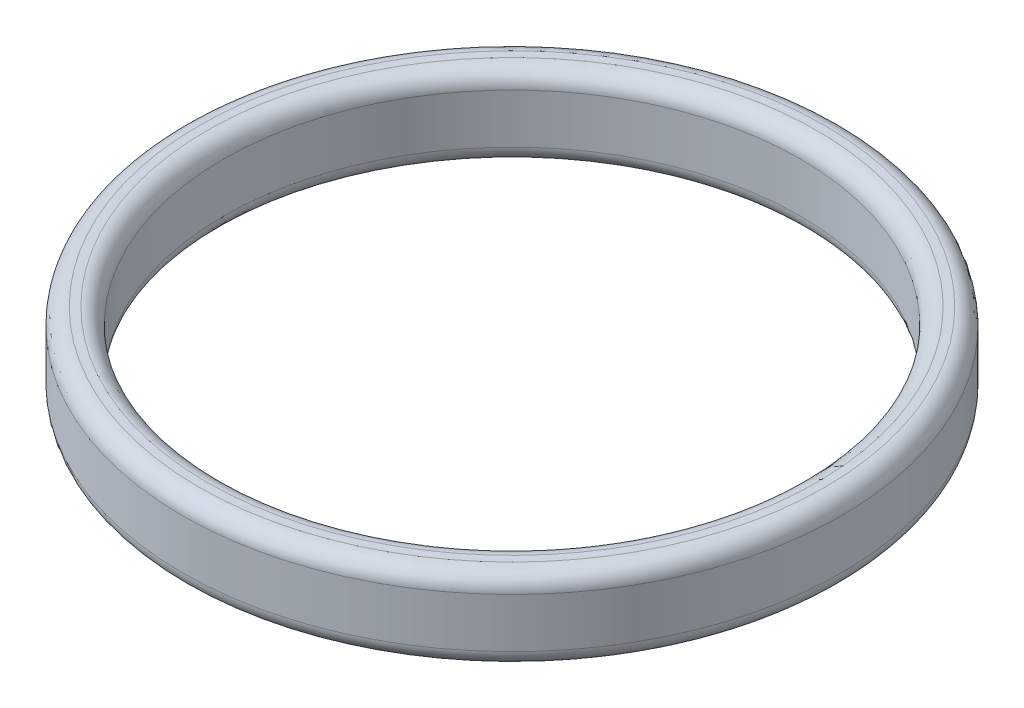
ISO-10303-21;
HEADER;
FILE_DESCRIPTION(('STEP AP214'),'2;1');
FILE_NAME('part.step','',(''),(''),'','','');
FILE_SCHEMA(('AUTOMOTIVE_DESIGN { 1 0 10303 214 1 1 1 1 }'));
ENDSEC;
DATA;
#1=APPLICATION_CONTEXT('core data for automotive mechanical design processes');
#2=APPLICATION_PROTOCOL_DEFINITION('international standard','automotive_design',2000,#1);
#3=PRODUCT_CONTEXT('',#1,'mechanical');
#4=PRODUCT('Part','Part','',(#3));
#5=PRODUCT_RELATED_PRODUCT_CATEGORY('part','',(#4));
#6=PRODUCT_DEFINITION_FORMATION('','',#4);
#7=PRODUCT_DEFINITION_CONTEXT('part definition',#1,'design');
#8=PRODUCT_DEFINITION('design','',#6,#7);
#9=PRODUCT_DEFINITION_SHAPE('','',#8);
#10=(LENGTH_UNIT() NAMED_UNIT(*) SI_UNIT(.MILLI.,.METRE.));
#11=(NAMED_UNIT(*) PLANE_ANGLE_UNIT() SI_UNIT($,.RADIAN.));
#12=(NAMED_UNIT(*) SI_UNIT($,.STERADIAN.) SOLID_ANGLE_UNIT());
#13=UNCERTAINTY_MEASURE_WITH_UNIT(LENGTH_MEASURE(1.E-05),#10,'distance_accuracy_value','');
#14=(GEOMETRIC_REPRESENTATION_CONTEXT(3) GLOBAL_UNCERTAINTY_ASSIGNED_CONTEXT((#13)) GLOBAL_UNIT_ASSIGNED_CONTEXT((#10,
#11,#12)) REPRESENTATION_CONTEXT('',''));
#15=CARTESIAN_POINT('',(0.,0.,0.));
#16=DIRECTION('',(0.,0.,1.));
#17=DIRECTION('',(1.,0.,0.));
#18=AXIS2_PLACEMENT_3D('',#15,#16,#17);
#19=CARTESIAN_POINT('',(0.,1.,0.));
#20=DIRECTION('',(0.,1.,0.));
#21=DIRECTION('',(0.,0.,1.));
#22=AXIS2_PLACEMENT_3D('',#19,#20,#21);
#23=PLANE('',#22);
#24=CARTESIAN_POINT('',(0.,1.,0.));
#25=DIRECTION('',(0.,1.,0.));
#26=DIRECTION('',(0.,0.,1.));
#27=AXIS2_PLACEMENT_3D('',#24,#25,#26);
#28=CIRCLE('',#27,3.7);
#29=CARTESIAN_POINT('',(0.,1.,3.7));
#30=VERTEX_POINT('',#29);
#31=EDGE_CURVE('E55',#30,#30,#28,.F.);
#32=ORIENTED_EDGE('',*,*,#31,.T.);
#33=EDGE_LOOP('',(#32));
#34=FACE_BOUND('',#33,.T.);
#35=CARTESIAN_POINT('',(0.,1.,0.));
#36=DIRECTION('',(0.,1.,0.));
#37=DIRECTION('',(0.,0.,1.));
#38=AXIS2_PLACEMENT_3D('',#35,#36,#37);
#39=CIRCLE('',#38,3.8);
#40=CARTESIAN_POINT('',(0.,1.,3.8));
#41=VERTEX_POINT('',#40);
#42=EDGE_CURVE('E58',#41,#41,#39,.T.);
#43=ORIENTED_EDGE('',*,*,#42,.T.);
#44=EDGE_LOOP('',(#43));
#45=FACE_BOUND('',#44,.T.);
#46=ADVANCED_FACE('F35',(#34,#45),#23,.T.);
#47=CARTESIAN_POINT('',(0.,0.,0.));
#48=DIRECTION('',(0.,1.,0.));
#49=DIRECTION('',(0.,0.,1.));
#50=AXIS2_PLACEMENT_3D('',#47,#48,#49);
#51=PLANE('',#50);
#52=CARTESIAN_POINT('',(0.,0.,0.));
#53=DIRECTION('',(0.,1.,0.));
#54=DIRECTION('',(0.,0.,1.));
#55=AXIS2_PLACEMENT_3D('',#52,#53,#54);
#56=CIRCLE('',#55,3.7);
#57=CARTESIAN_POINT('',(0.,0.,3.7));
#58=VERTEX_POINT('',#57);
#59=EDGE_CURVE('E10',#58,#58,#56,.T.);
#60=ORIENTED_EDGE('',*,*,#59,.T.);
#61=EDGE_LOOP('',(#60));
#62=FACE_BOUND('',#61,.T.);
#63=CARTESIAN_POINT('',(0.,0.,0.));
#64=DIRECTION('',(0.,1.,0.));
#65=DIRECTION('',(0.,0.,1.));
#66=AXIS2_PLACEMENT_3D('',#63,#64,#65);
#67=CIRCLE('',#66,3.8);
#68=CARTESIAN_POINT('',(0.,0.,3.8));
#69=VERTEX_POINT('',#68);
#70=EDGE_CURVE('E42',#69,#69,#67,.F.);
#71=ORIENTED_EDGE('',*,*,#70,.T.);
#72=EDGE_LOOP('',(#71));
#73=FACE_BOUND('',#72,.T.);
#74=ADVANCED_FACE('F83',(#62,#73),#51,.F.);
#75=CARTESIAN_POINT('',(0.,1.,0.));
#76=DIRECTION('',(0.,-1.,0.));
#77=DIRECTION('',(0.,0.,-1.));
#78=AXIS2_PLACEMENT_3D('',#75,#76,#77);
#79=CYLINDRICAL_SURFACE('',#78,4.);
#80=CARTESIAN_POINT('',(0.,0.8,0.));
#81=DIRECTION('',(0.,1.,0.));
#82=DIRECTION('',(0.,0.,1.));
#83=AXIS2_PLACEMENT_3D('',#80,#81,#82);
#84=CIRCLE('',#83,4.);
#85=CARTESIAN_POINT('',(0.,0.8,4.));
#86=VERTEX_POINT('',#85);
#87=EDGE_CURVE('E46',#86,#86,#84,.F.);
#88=ORIENTED_EDGE('',*,*,#87,.T.);
#89=EDGE_LOOP('',(#88));
#90=FACE_BOUND('',#89,.T.);
#91=CARTESIAN_POINT('',(0.,0.2,0.));
#92=DIRECTION('',(0.,1.,0.));
#93=DIRECTION('',(0.,0.,1.));
#94=AXIS2_PLACEMENT_3D('',#91,#92,#93);
#95=CIRCLE('',#94,4.);
#96=CARTESIAN_POINT('',(0.,0.2,4.));
#97=VERTEX_POINT('',#96);
#98=EDGE_CURVE('E50',#97,#97,#95,.T.);
#99=ORIENTED_EDGE('',*,*,#98,.T.);
#100=EDGE_LOOP('',(#99));
#101=FACE_BOUND('',#100,.T.);
#102=ADVANCED_FACE('F89',(#90,#101),#79,.T.);
#103=CARTESIAN_POINT('',(0.,1.,0.));
#104=DIRECTION('',(0.,-1.,0.));
#105=DIRECTION('',(0.,0.,-1.));
#106=AXIS2_PLACEMENT_3D('',#103,#104,#105);
#107=CYLINDRICAL_SURFACE('',#106,3.5);
#108=CARTESIAN_POINT('',(0.,0.8,0.));
#109=DIRECTION('',(0.,1.,0.));
#110=DIRECTION('',(0.,0.,1.));
#111=AXIS2_PLACEMENT_3D('',#108,#109,#110);
#112=CIRCLE('',#111,3.5);
#113=CARTESIAN_POINT('',(0.,0.8,3.5));
#114=VERTEX_POINT('',#113);
#115=EDGE_CURVE('E61',#114,#114,#112,.T.);
#116=ORIENTED_EDGE('',*,*,#115,.T.);
#117=EDGE_LOOP('',(#116));
#118=FACE_BOUND('',#117,.T.);
#119=CARTESIAN_POINT('',(0.,0.2,0.));
#120=DIRECTION('',(0.,1.,0.));
#121=DIRECTION('',(0.,0.,1.));
#122=AXIS2_PLACEMENT_3D('',#119,#120,#121);
#123=CIRCLE('',#122,3.5);
#124=CARTESIAN_POINT('',(0.,0.2,3.5));
#125=VERTEX_POINT('',#124);
#126=EDGE_CURVE('E64',#125,#125,#123,.F.);
#127=ORIENTED_EDGE('',*,*,#126,.T.);
#128=EDGE_LOOP('',(#127));
#129=FACE_BOUND('',#128,.T.);
#130=ADVANCED_FACE('F68',(#118,#129),#107,.F.);
#131=CARTESIAN_POINT('',(0.,0.8,0.));
#132=DIRECTION('',(0.,1.,0.));
#133=DIRECTION('',(0.,0.,1.));
#134=AXIS2_PLACEMENT_3D('',#131,#132,#133);
#135=TOROIDAL_SURFACE('',#134,3.7,0.2);
#136=ORIENTED_EDGE('',*,*,#31,.F.);
#137=EDGE_LOOP('',(#136));
#138=FACE_BOUND('',#137,.T.);
#139=ORIENTED_EDGE('',*,*,#115,.F.);
#140=EDGE_LOOP('',(#139));
#141=FACE_BOUND('',#140,.T.);
#142=ADVANCED_FACE('F79',(#138,#141),#135,.T.);
#143=CARTESIAN_POINT('',(0.,0.8,0.));
#144=DIRECTION('',(0.,1.,0.));
#145=DIRECTION('',(0.,0.,1.));
#146=AXIS2_PLACEMENT_3D('',#143,#144,#145);
#147=TOROIDAL_SURFACE('',#146,3.8,0.2);
#148=ORIENTED_EDGE('',*,*,#87,.F.);
#149=EDGE_LOOP('',(#148));
#150=FACE_BOUND('',#149,.T.);
#151=ORIENTED_EDGE('',*,*,#42,.F.);
#152=EDGE_LOOP('',(#151));
#153=FACE_BOUND('',#152,.T.);
#154=ADVANCED_FACE('F73',(#150,#153),#147,.T.);
#155=CARTESIAN_POINT('',(0.,0.2,0.));
#156=DIRECTION('',(0.,1.,0.));
#157=DIRECTION('',(0.,0.,1.));
#158=AXIS2_PLACEMENT_3D('',#155,#156,#157);
#159=TOROIDAL_SURFACE('',#158,3.7,0.2);
#160=ORIENTED_EDGE('',*,*,#126,.F.);
#161=EDGE_LOOP('',(#160));
#162=FACE_BOUND('',#161,.T.);
#163=ORIENTED_EDGE('',*,*,#59,.F.);
#164=EDGE_LOOP('',(#163));
#165=FACE_BOUND('',#164,.T.);
#166=ADVANCED_FACE('F70',(#162,#165),#159,.T.);
#167=CARTESIAN_POINT('',(0.,0.2,0.));
#168=DIRECTION('',(0.,1.,0.));
#169=DIRECTION('',(0.,0.,1.));
#170=AXIS2_PLACEMENT_3D('',#167,#168,#169);
#171=TOROIDAL_SURFACE('',#170,3.8,0.2);
#172=ORIENTED_EDGE('',*,*,#70,.F.);
#173=EDGE_LOOP('',(#172));
#174=FACE_BOUND('',#173,.T.);
#175=ORIENTED_EDGE('',*,*,#98,.F.);
#176=EDGE_LOOP('',(#175));
#177=FACE_BOUND('',#176,.T.);
#178=ADVANCED_FACE('F37',(#174,#177),#171,.T.);
#179=CLOSED_SHELL('',(#46,#74,#102,#130,#142,#154,#166,#178));
#180=MANIFOLD_SOLID_BREP('B2',#179);
#181=ADVANCED_BREP_SHAPE_REPRESENTATION('',(#18,#180),#14);
#182=SHAPE_DEFINITION_REPRESENTATION(#9,#181);
ENDSEC;
END-ISO-10303-21;
